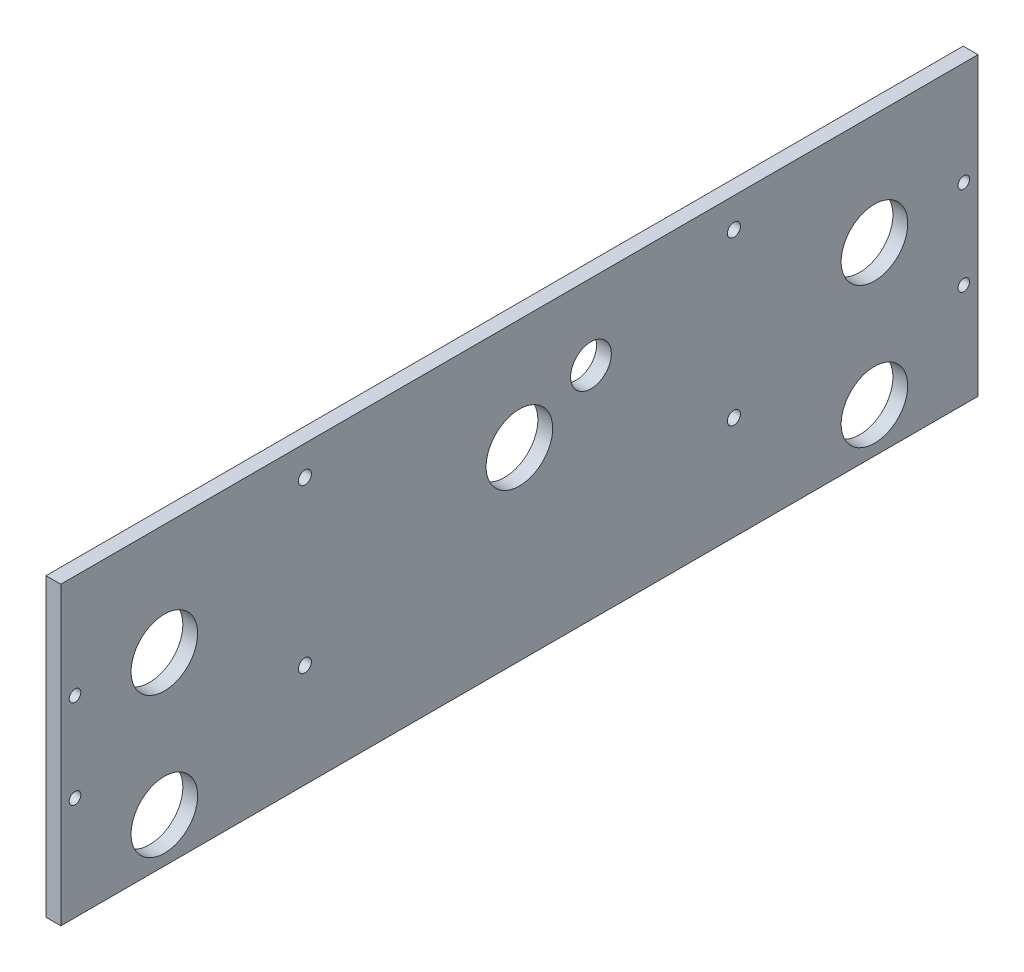
ISO-10303-21;
HEADER;
FILE_DESCRIPTION(('STEP AP214'),'2;1');
FILE_NAME('part.step','',(''),(''),'','','');
FILE_SCHEMA(('AUTOMOTIVE_DESIGN { 1 0 10303 214 1 1 1 1 }'));
ENDSEC;
DATA;
#1=APPLICATION_CONTEXT('core data for automotive mechanical design processes');
#2=APPLICATION_PROTOCOL_DEFINITION('international standard','automotive_design',2000,#1);
#3=PRODUCT_CONTEXT('',#1,'mechanical');
#4=PRODUCT('Part','Part','',(#3));
#5=PRODUCT_RELATED_PRODUCT_CATEGORY('part','',(#4));
#6=PRODUCT_DEFINITION_FORMATION('','',#4);
#7=PRODUCT_DEFINITION_CONTEXT('part definition',#1,'design');
#8=PRODUCT_DEFINITION('design','',#6,#7);
#9=PRODUCT_DEFINITION_SHAPE('','',#8);
#10=(LENGTH_UNIT() NAMED_UNIT(*) SI_UNIT(.MILLI.,.METRE.));
#11=(NAMED_UNIT(*) PLANE_ANGLE_UNIT() SI_UNIT($,.RADIAN.));
#12=(NAMED_UNIT(*) SI_UNIT($,.STERADIAN.) SOLID_ANGLE_UNIT());
#13=UNCERTAINTY_MEASURE_WITH_UNIT(LENGTH_MEASURE(1.E-05),#10,'distance_accuracy_value','');
#14=(GEOMETRIC_REPRESENTATION_CONTEXT(3) GLOBAL_UNCERTAINTY_ASSIGNED_CONTEXT((#13)) GLOBAL_UNIT_ASSIGNED_CONTEXT((#10,
#11,#12)) REPRESENTATION_CONTEXT('',''));
#15=CARTESIAN_POINT('',(0.,0.,0.));
#16=DIRECTION('',(0.,0.,1.));
#17=DIRECTION('',(1.,0.,0.));
#18=AXIS2_PLACEMENT_3D('',#15,#16,#17);
#19=CARTESIAN_POINT('',(6.35,63.5,-196.85));
#20=DIRECTION('',(0.,0.,1.));
#21=DIRECTION('',(1.,0.,0.));
#22=AXIS2_PLACEMENT_3D('',#19,#20,#21);
#23=PLANE('',#22);
#24=DIRECTION('',(0.,1.,0.));
#25=VECTOR('',#24,1.);
#26=CARTESIAN_POINT('',(0.,63.5,-196.85));
#27=LINE('',#26,#25);
#28=CARTESIAN_POINT('',(0.,-63.5,-196.85));
#29=VERTEX_POINT('',#28);
#30=CARTESIAN_POINT('',(0.,63.5,-196.85));
#31=VERTEX_POINT('',#30);
#32=EDGE_CURVE('E102',#29,#31,#27,.T.);
#33=ORIENTED_EDGE('',*,*,#32,.T.);
#34=DIRECTION('',(-1.,0.,0.));
#35=VECTOR('',#34,1.);
#36=CARTESIAN_POINT('',(6.35,63.5,-196.85));
#37=LINE('',#36,#35);
#38=CARTESIAN_POINT('',(6.35,63.5,-196.85));
#39=VERTEX_POINT('',#38);
#40=EDGE_CURVE('E11',#39,#31,#37,.T.);
#41=ORIENTED_EDGE('',*,*,#40,.F.);
#42=DIRECTION('',(0.,1.,0.));
#43=VECTOR('',#42,1.);
#44=CARTESIAN_POINT('',(6.35,63.5,-196.85));
#45=LINE('',#44,#43);
#46=CARTESIAN_POINT('',(6.35,-63.5,-196.85));
#47=VERTEX_POINT('',#46);
#48=EDGE_CURVE('E90',#47,#39,#45,.T.);
#49=ORIENTED_EDGE('',*,*,#48,.F.);
#50=DIRECTION('',(-1.,0.,0.));
#51=VECTOR('',#50,1.);
#52=CARTESIAN_POINT('',(6.35,-63.5,-196.85));
#53=LINE('',#52,#51);
#54=EDGE_CURVE('E98',#47,#29,#53,.T.);
#55=ORIENTED_EDGE('',*,*,#54,.T.);
#56=EDGE_LOOP('',(#33,#41,#49,#55));
#57=FACE_BOUND('',#56,.T.);
#58=ADVANCED_FACE('F39',(#57),#23,.F.);
#59=CARTESIAN_POINT('',(6.35,63.5,196.85));
#60=DIRECTION('',(0.,-1.,0.));
#61=DIRECTION('',(0.,0.,-1.));
#62=AXIS2_PLACEMENT_3D('',#59,#60,#61);
#63=PLANE('',#62);
#64=DIRECTION('',(0.,0.,1.));
#65=VECTOR('',#64,1.);
#66=CARTESIAN_POINT('',(0.,63.5,196.85));
#67=LINE('',#66,#65);
#68=CARTESIAN_POINT('',(0.,63.5,196.85));
#69=VERTEX_POINT('',#68);
#70=EDGE_CURVE('E94',#31,#69,#67,.T.);
#71=ORIENTED_EDGE('',*,*,#70,.T.);
#72=DIRECTION('',(-1.,0.,0.));
#73=VECTOR('',#72,1.);
#74=CARTESIAN_POINT('',(6.35,63.5,196.85));
#75=LINE('',#74,#73);
#76=CARTESIAN_POINT('',(6.35,63.5,196.85));
#77=VERTEX_POINT('',#76);
#78=EDGE_CURVE('E47',#77,#69,#75,.T.);
#79=ORIENTED_EDGE('',*,*,#78,.F.);
#80=DIRECTION('',(0.,0.,1.));
#81=VECTOR('',#80,1.);
#82=CARTESIAN_POINT('',(6.35,63.5,196.85));
#83=LINE('',#82,#81);
#84=EDGE_CURVE('E85',#39,#77,#83,.T.);
#85=ORIENTED_EDGE('',*,*,#84,.F.);
#86=ORIENTED_EDGE('',*,*,#40,.T.);
#87=EDGE_LOOP('',(#71,#79,#85,#86));
#88=FACE_BOUND('',#87,.T.);
#89=ADVANCED_FACE('F93',(#88),#63,.F.);
#90=CARTESIAN_POINT('',(6.35,63.5,196.85));
#91=DIRECTION('',(0.,0.,-1.));
#92=DIRECTION('',(-1.,0.,0.));
#93=AXIS2_PLACEMENT_3D('',#90,#91,#92);
#94=PLANE('',#93);
#95=DIRECTION('',(0.,-1.,0.));
#96=VECTOR('',#95,1.);
#97=CARTESIAN_POINT('',(0.,63.5,196.85));
#98=LINE('',#97,#96);
#99=CARTESIAN_POINT('',(0.,-63.5,196.85));
#100=VERTEX_POINT('',#99);
#101=EDGE_CURVE('E72',#69,#100,#98,.T.);
#102=ORIENTED_EDGE('',*,*,#101,.T.);
#103=DIRECTION('',(-1.,0.,0.));
#104=VECTOR('',#103,1.);
#105=CARTESIAN_POINT('',(6.35,-63.5,196.85));
#106=LINE('',#105,#104);
#107=CARTESIAN_POINT('',(6.35,-63.5,196.85));
#108=VERTEX_POINT('',#107);
#109=EDGE_CURVE('E95',#108,#100,#106,.T.);
#110=ORIENTED_EDGE('',*,*,#109,.F.);
#111=DIRECTION('',(0.,-1.,0.));
#112=VECTOR('',#111,1.);
#113=CARTESIAN_POINT('',(6.35,63.5,196.85));
#114=LINE('',#113,#112);
#115=EDGE_CURVE('E88',#77,#108,#114,.T.);
#116=ORIENTED_EDGE('',*,*,#115,.F.);
#117=ORIENTED_EDGE('',*,*,#78,.T.);
#118=EDGE_LOOP('',(#102,#110,#116,#117));
#119=FACE_BOUND('',#118,.T.);
#120=ADVANCED_FACE('F96',(#119),#94,.F.);
#121=CARTESIAN_POINT('',(6.35,-63.5,196.85));
#122=DIRECTION('',(0.,1.,0.));
#123=DIRECTION('',(0.,0.,1.));
#124=AXIS2_PLACEMENT_3D('',#121,#122,#123);
#125=PLANE('',#124);
#126=DIRECTION('',(0.,0.,-1.));
#127=VECTOR('',#126,1.);
#128=CARTESIAN_POINT('',(0.,-63.5,196.85));
#129=LINE('',#128,#127);
#130=EDGE_CURVE('E78',#100,#29,#129,.T.);
#131=ORIENTED_EDGE('',*,*,#130,.T.);
#132=ORIENTED_EDGE('',*,*,#54,.F.);
#133=DIRECTION('',(0.,0.,-1.));
#134=VECTOR('',#133,1.);
#135=CARTESIAN_POINT('',(6.35,-63.5,196.85));
#136=LINE('',#135,#134);
#137=EDGE_CURVE('E55',#108,#47,#136,.T.);
#138=ORIENTED_EDGE('',*,*,#137,.F.);
#139=ORIENTED_EDGE('',*,*,#109,.T.);
#140=EDGE_LOOP('',(#131,#132,#138,#139));
#141=FACE_BOUND('',#140,.T.);
#142=ADVANCED_FACE('F110',(#141),#125,.F.);
#143=CARTESIAN_POINT('',(6.35,0.,0.));
#144=DIRECTION('',(1.,0.,0.));
#145=DIRECTION('',(0.,0.,-1.));
#146=AXIS2_PLACEMENT_3D('',#143,#144,#145);
#147=PLANE('',#146);
#148=CARTESIAN_POINT('',(6.35,50.8,-92.075));
#149=DIRECTION('',(-1.,0.,0.));
#150=DIRECTION('',(0.,0.,1.));
#151=AXIS2_PLACEMENT_3D('',#148,#149,#150);
#152=CIRCLE('',#151,2.8067);
#153=CARTESIAN_POINT('',(6.35,50.8,-89.2683));
#154=VERTEX_POINT('',#153);
#155=EDGE_CURVE('E202',#154,#154,#152,.T.);
#156=ORIENTED_EDGE('',*,*,#155,.T.);
#157=EDGE_LOOP('',(#156));
#158=FACE_BOUND('',#157,.T.);
#159=CARTESIAN_POINT('',(6.35,-19.05,-92.075));
#160=DIRECTION('',(-1.,0.,0.));
#161=DIRECTION('',(0.,0.,1.));
#162=AXIS2_PLACEMENT_3D('',#159,#160,#161);
#163=CIRCLE('',#162,2.8067);
#164=CARTESIAN_POINT('',(6.35,-19.05,-89.2683));
#165=VERTEX_POINT('',#164);
#166=EDGE_CURVE('E193',#165,#165,#163,.T.);
#167=ORIENTED_EDGE('',*,*,#166,.T.);
#168=EDGE_LOOP('',(#167));
#169=FACE_BOUND('',#168,.T.);
#170=CARTESIAN_POINT('',(6.35,-19.05,92.075));
#171=DIRECTION('',(-1.,0.,0.));
#172=DIRECTION('',(0.,0.,1.));
#173=AXIS2_PLACEMENT_3D('',#170,#171,#172);
#174=CIRCLE('',#173,2.8067);
#175=CARTESIAN_POINT('',(6.35,-19.05,94.8817));
#176=VERTEX_POINT('',#175);
#177=EDGE_CURVE('E184',#176,#176,#174,.T.);
#178=ORIENTED_EDGE('',*,*,#177,.T.);
#179=EDGE_LOOP('',(#178));
#180=FACE_BOUND('',#179,.T.);
#181=CARTESIAN_POINT('',(6.35,50.8,92.075));
#182=DIRECTION('',(-1.,0.,0.));
#183=DIRECTION('',(0.,0.,1.));
#184=AXIS2_PLACEMENT_3D('',#181,#182,#183);
#185=CIRCLE('',#184,2.8067);
#186=CARTESIAN_POINT('',(6.35,50.8,94.8817));
#187=VERTEX_POINT('',#186);
#188=EDGE_CURVE('E175',#187,#187,#185,.T.);
#189=ORIENTED_EDGE('',*,*,#188,.T.);
#190=EDGE_LOOP('',(#189));
#191=FACE_BOUND('',#190,.T.);
#192=CARTESIAN_POINT('',(6.35,19.05,190.754));
#193=DIRECTION('',(1.,0.,0.));
#194=DIRECTION('',(0.,0.,-1.));
#195=AXIS2_PLACEMENT_3D('',#192,#193,#194);
#196=CIRCLE('',#195,2.4892);
#197=CARTESIAN_POINT('',(6.35,19.05,188.2648));
#198=VERTEX_POINT('',#197);
#199=EDGE_CURVE('E172',#198,#198,#196,.T.);
#200=ORIENTED_EDGE('',*,*,#199,.F.);
#201=EDGE_LOOP('',(#200));
#202=FACE_BOUND('',#201,.T.);
#203=CARTESIAN_POINT('',(6.35,-19.05,190.754));
#204=DIRECTION('',(1.,0.,0.));
#205=DIRECTION('',(0.,0.,-1.));
#206=AXIS2_PLACEMENT_3D('',#203,#204,#205);
#207=CIRCLE('',#206,2.4892);
#208=CARTESIAN_POINT('',(6.35,-19.05,188.2648));
#209=VERTEX_POINT('',#208);
#210=EDGE_CURVE('E166',#209,#209,#207,.T.);
#211=ORIENTED_EDGE('',*,*,#210,.F.);
#212=EDGE_LOOP('',(#211));
#213=FACE_BOUND('',#212,.T.);
#214=CARTESIAN_POINT('',(6.35,19.05,-190.754));
#215=DIRECTION('',(1.,0.,0.));
#216=DIRECTION('',(0.,0.,-1.));
#217=AXIS2_PLACEMENT_3D('',#214,#215,#216);
#218=CIRCLE('',#217,2.4892);
#219=CARTESIAN_POINT('',(6.35,19.05,-193.2432));
#220=VERTEX_POINT('',#219);
#221=EDGE_CURVE('E160',#220,#220,#218,.T.);
#222=ORIENTED_EDGE('',*,*,#221,.F.);
#223=EDGE_LOOP('',(#222));
#224=FACE_BOUND('',#223,.T.);
#225=CARTESIAN_POINT('',(6.35,-19.05,-190.754));
#226=DIRECTION('',(1.,0.,0.));
#227=DIRECTION('',(0.,0.,-1.));
#228=AXIS2_PLACEMENT_3D('',#225,#226,#227);
#229=CIRCLE('',#228,2.4892);
#230=CARTESIAN_POINT('',(6.35,-19.05,-193.2432));
#231=VERTEX_POINT('',#230);
#232=EDGE_CURVE('E154',#231,#231,#229,.T.);
#233=ORIENTED_EDGE('',*,*,#232,.F.);
#234=EDGE_LOOP('',(#233));
#235=FACE_BOUND('',#234,.T.);
#236=CARTESIAN_POINT('',(6.35,15.875,152.4));
#237=DIRECTION('',(1.,0.,0.));
#238=DIRECTION('',(0.,0.,-1.));
#239=AXIS2_PLACEMENT_3D('',#236,#237,#238);
#240=CIRCLE('',#239,14.2875);
#241=CARTESIAN_POINT('',(6.35,15.875,138.1125));
#242=VERTEX_POINT('',#241);
#243=EDGE_CURVE('E119',#242,#242,#240,.T.);
#244=ORIENTED_EDGE('',*,*,#243,.F.);
#245=EDGE_LOOP('',(#244));
#246=FACE_BOUND('',#245,.T.);
#247=CARTESIAN_POINT('',(6.35,15.875,-152.4));
#248=DIRECTION('',(1.,0.,0.));
#249=DIRECTION('',(0.,0.,-1.));
#250=AXIS2_PLACEMENT_3D('',#247,#248,#249);
#251=CIRCLE('',#250,14.2875);
#252=CARTESIAN_POINT('',(6.35,15.875,-166.6875));
#253=VERTEX_POINT('',#252);
#254=EDGE_CURVE('E138',#253,#253,#251,.T.);
#255=ORIENTED_EDGE('',*,*,#254,.F.);
#256=EDGE_LOOP('',(#255));
#257=FACE_BOUND('',#256,.T.);
#258=CARTESIAN_POINT('',(6.35,-44.45,152.4));
#259=DIRECTION('',(1.,0.,0.));
#260=DIRECTION('',(0.,0.,-1.));
#261=AXIS2_PLACEMENT_3D('',#258,#259,#260);
#262=CIRCLE('',#261,14.2875);
#263=CARTESIAN_POINT('',(6.35,-44.45,138.1125));
#264=VERTEX_POINT('',#263);
#265=EDGE_CURVE('E132',#264,#264,#262,.T.);
#266=ORIENTED_EDGE('',*,*,#265,.F.);
#267=EDGE_LOOP('',(#266));
#268=FACE_BOUND('',#267,.T.);
#269=CARTESIAN_POINT('',(6.35,-44.45,-152.4));
#270=DIRECTION('',(1.,0.,0.));
#271=DIRECTION('',(0.,0.,-1.));
#272=AXIS2_PLACEMENT_3D('',#269,#270,#271);
#273=CIRCLE('',#272,14.2875);
#274=CARTESIAN_POINT('',(6.35,-44.45,-166.6875));
#275=VERTEX_POINT('',#274);
#276=EDGE_CURVE('E125',#275,#275,#273,.T.);
#277=ORIENTED_EDGE('',*,*,#276,.F.);
#278=EDGE_LOOP('',(#277));
#279=FACE_BOUND('',#278,.T.);
#280=CARTESIAN_POINT('',(6.35,31.115,-30.7172020210175));
#281=DIRECTION('',(1.,0.,0.));
#282=DIRECTION('',(0.,0.,-1.));
#283=AXIS2_PLACEMENT_3D('',#280,#281,#282);
#284=CIRCLE('',#283,8.750046);
#285=CARTESIAN_POINT('',(6.35,31.115,-39.4672480210175));
#286=VERTEX_POINT('',#285);
#287=EDGE_CURVE('E126',#286,#286,#284,.T.);
#288=ORIENTED_EDGE('',*,*,#287,.F.);
#289=EDGE_LOOP('',(#288));
#290=FACE_BOUND('',#289,.T.);
#291=CARTESIAN_POINT('',(6.35,15.875,0.));
#292=DIRECTION('',(1.,0.,0.));
#293=DIRECTION('',(0.,0.,-1.));
#294=AXIS2_PLACEMENT_3D('',#291,#292,#293);
#295=CIRCLE('',#294,14.2875);
#296=CARTESIAN_POINT('',(6.35,15.875,-14.2875));
#297=VERTEX_POINT('',#296);
#298=EDGE_CURVE('E116',#297,#297,#295,.T.);
#299=ORIENTED_EDGE('',*,*,#298,.F.);
#300=EDGE_LOOP('',(#299));
#301=FACE_BOUND('',#300,.T.);
#302=ORIENTED_EDGE('',*,*,#48,.T.);
#303=ORIENTED_EDGE('',*,*,#84,.T.);
#304=ORIENTED_EDGE('',*,*,#115,.T.);
#305=ORIENTED_EDGE('',*,*,#137,.T.);
#306=EDGE_LOOP('',(#302,#303,#304,#305));
#307=FACE_BOUND('',#306,.T.);
#308=ADVANCED_FACE('F86',(#158,#169,#180,#191,#202,#213,#224,#235,#246,#257,#268,#279,#290,#301,
#307),#147,.T.);
#309=CARTESIAN_POINT('',(0.,0.,0.));
#310=DIRECTION('',(1.,0.,0.));
#311=DIRECTION('',(0.,0.,-1.));
#312=AXIS2_PLACEMENT_3D('',#309,#310,#311);
#313=PLANE('',#312);
#314=CARTESIAN_POINT('',(0.,50.8,-92.075));
#315=DIRECTION('',(-1.,0.,0.));
#316=DIRECTION('',(0.,0.,1.));
#317=AXIS2_PLACEMENT_3D('',#314,#315,#316);
#318=CIRCLE('',#317,4.8895);
#319=CARTESIAN_POINT('',(0.,50.8,-87.1855));
#320=VERTEX_POINT('',#319);
#321=EDGE_CURVE('E208',#320,#320,#318,.T.);
#322=ORIENTED_EDGE('',*,*,#321,.F.);
#323=EDGE_LOOP('',(#322));
#324=FACE_BOUND('',#323,.T.);
#325=CARTESIAN_POINT('',(0.,-19.05,-92.075));
#326=DIRECTION('',(-1.,0.,0.));
#327=DIRECTION('',(0.,0.,1.));
#328=AXIS2_PLACEMENT_3D('',#325,#326,#327);
#329=CIRCLE('',#328,4.8895);
#330=CARTESIAN_POINT('',(0.,-19.05,-87.1855));
#331=VERTEX_POINT('',#330);
#332=EDGE_CURVE('E199',#331,#331,#329,.T.);
#333=ORIENTED_EDGE('',*,*,#332,.F.);
#334=EDGE_LOOP('',(#333));
#335=FACE_BOUND('',#334,.T.);
#336=CARTESIAN_POINT('',(0.,-19.05,92.075));
#337=DIRECTION('',(-1.,0.,0.));
#338=DIRECTION('',(0.,0.,1.));
#339=AXIS2_PLACEMENT_3D('',#336,#337,#338);
#340=CIRCLE('',#339,4.8895);
#341=CARTESIAN_POINT('',(0.,-19.05,96.9645));
#342=VERTEX_POINT('',#341);
#343=EDGE_CURVE('E190',#342,#342,#340,.T.);
#344=ORIENTED_EDGE('',*,*,#343,.F.);
#345=EDGE_LOOP('',(#344));
#346=FACE_BOUND('',#345,.T.);
#347=CARTESIAN_POINT('',(0.,50.8,92.075));
#348=DIRECTION('',(-1.,0.,0.));
#349=DIRECTION('',(0.,0.,1.));
#350=AXIS2_PLACEMENT_3D('',#347,#348,#349);
#351=CIRCLE('',#350,4.8895);
#352=CARTESIAN_POINT('',(0.,50.8,96.9645));
#353=VERTEX_POINT('',#352);
#354=EDGE_CURVE('E181',#353,#353,#351,.T.);
#355=ORIENTED_EDGE('',*,*,#354,.F.);
#356=EDGE_LOOP('',(#355));
#357=FACE_BOUND('',#356,.T.);
#358=CARTESIAN_POINT('',(0.,19.05,190.754));
#359=DIRECTION('',(1.,0.,0.));
#360=DIRECTION('',(0.,0.,-1.));
#361=AXIS2_PLACEMENT_3D('',#358,#359,#360);
#362=CIRCLE('',#361,2.4892);
#363=CARTESIAN_POINT('',(0.,19.05,188.2648));
#364=VERTEX_POINT('',#363);
#365=EDGE_CURVE('E169',#364,#364,#362,.T.);
#366=ORIENTED_EDGE('',*,*,#365,.T.);
#367=EDGE_LOOP('',(#366));
#368=FACE_BOUND('',#367,.T.);
#369=CARTESIAN_POINT('',(0.,-19.05,190.754));
#370=DIRECTION('',(1.,0.,0.));
#371=DIRECTION('',(0.,0.,-1.));
#372=AXIS2_PLACEMENT_3D('',#369,#370,#371);
#373=CIRCLE('',#372,2.4892);
#374=CARTESIAN_POINT('',(0.,-19.05,188.2648));
#375=VERTEX_POINT('',#374);
#376=EDGE_CURVE('E163',#375,#375,#373,.T.);
#377=ORIENTED_EDGE('',*,*,#376,.T.);
#378=EDGE_LOOP('',(#377));
#379=FACE_BOUND('',#378,.T.);
#380=CARTESIAN_POINT('',(0.,19.05,-190.754));
#381=DIRECTION('',(1.,0.,0.));
#382=DIRECTION('',(0.,0.,-1.));
#383=AXIS2_PLACEMENT_3D('',#380,#381,#382);
#384=CIRCLE('',#383,2.4892);
#385=CARTESIAN_POINT('',(0.,19.05,-193.2432));
#386=VERTEX_POINT('',#385);
#387=EDGE_CURVE('E157',#386,#386,#384,.T.);
#388=ORIENTED_EDGE('',*,*,#387,.T.);
#389=EDGE_LOOP('',(#388));
#390=FACE_BOUND('',#389,.T.);
#391=CARTESIAN_POINT('',(0.,-19.05,-190.754));
#392=DIRECTION('',(1.,0.,0.));
#393=DIRECTION('',(0.,0.,-1.));
#394=AXIS2_PLACEMENT_3D('',#391,#392,#393);
#395=CIRCLE('',#394,2.4892);
#396=CARTESIAN_POINT('',(0.,-19.05,-193.2432));
#397=VERTEX_POINT('',#396);
#398=EDGE_CURVE('E149',#397,#397,#395,.T.);
#399=ORIENTED_EDGE('',*,*,#398,.T.);
#400=EDGE_LOOP('',(#399));
#401=FACE_BOUND('',#400,.T.);
#402=CARTESIAN_POINT('',(0.,15.875,152.4));
#403=DIRECTION('',(1.,0.,0.));
#404=DIRECTION('',(0.,0.,-1.));
#405=AXIS2_PLACEMENT_3D('',#402,#403,#404);
#406=CIRCLE('',#405,14.2875);
#407=CARTESIAN_POINT('',(0.,15.875,138.1125));
#408=VERTEX_POINT('',#407);
#409=EDGE_CURVE('E141',#408,#408,#406,.T.);
#410=ORIENTED_EDGE('',*,*,#409,.T.);
#411=EDGE_LOOP('',(#410));
#412=FACE_BOUND('',#411,.T.);
#413=CARTESIAN_POINT('',(0.,15.875,-152.4));
#414=DIRECTION('',(1.,0.,0.));
#415=DIRECTION('',(0.,0.,-1.));
#416=AXIS2_PLACEMENT_3D('',#413,#414,#415);
#417=CIRCLE('',#416,14.2875);
#418=CARTESIAN_POINT('',(0.,15.875,-166.6875));
#419=VERTEX_POINT('',#418);
#420=EDGE_CURVE('E135',#419,#419,#417,.T.);
#421=ORIENTED_EDGE('',*,*,#420,.T.);
#422=EDGE_LOOP('',(#421));
#423=FACE_BOUND('',#422,.T.);
#424=CARTESIAN_POINT('',(0.,-44.45,152.4));
#425=DIRECTION('',(1.,0.,0.));
#426=DIRECTION('',(0.,0.,-1.));
#427=AXIS2_PLACEMENT_3D('',#424,#425,#426);
#428=CIRCLE('',#427,14.2875);
#429=CARTESIAN_POINT('',(0.,-44.45,138.1125));
#430=VERTEX_POINT('',#429);
#431=EDGE_CURVE('E129',#430,#430,#428,.T.);
#432=ORIENTED_EDGE('',*,*,#431,.T.);
#433=EDGE_LOOP('',(#432));
#434=FACE_BOUND('',#433,.T.);
#435=CARTESIAN_POINT('',(0.,-44.45,-152.4));
#436=DIRECTION('',(1.,0.,0.));
#437=DIRECTION('',(0.,0.,-1.));
#438=AXIS2_PLACEMENT_3D('',#435,#436,#437);
#439=CIRCLE('',#438,14.2875);
#440=CARTESIAN_POINT('',(0.,-44.45,-166.6875));
#441=VERTEX_POINT('',#440);
#442=EDGE_CURVE('E122',#441,#441,#439,.T.);
#443=ORIENTED_EDGE('',*,*,#442,.T.);
#444=EDGE_LOOP('',(#443));
#445=FACE_BOUND('',#444,.T.);
#446=CARTESIAN_POINT('',(0.,31.115,-30.7172020210175));
#447=DIRECTION('',(1.,0.,0.));
#448=DIRECTION('',(0.,0.,-1.));
#449=AXIS2_PLACEMENT_3D('',#446,#447,#448);
#450=CIRCLE('',#449,8.750046);
#451=CARTESIAN_POINT('',(0.,31.115,-39.4672480210175));
#452=VERTEX_POINT('',#451);
#453=EDGE_CURVE('E146',#452,#452,#450,.T.);
#454=ORIENTED_EDGE('',*,*,#453,.T.);
#455=EDGE_LOOP('',(#454));
#456=FACE_BOUND('',#455,.T.);
#457=CARTESIAN_POINT('',(0.,15.875,0.));
#458=DIRECTION('',(1.,0.,0.));
#459=DIRECTION('',(0.,0.,-1.));
#460=AXIS2_PLACEMENT_3D('',#457,#458,#459);
#461=CIRCLE('',#460,14.2875);
#462=CARTESIAN_POINT('',(0.,15.875,-14.2875));
#463=VERTEX_POINT('',#462);
#464=EDGE_CURVE('E105',#463,#463,#461,.T.);
#465=ORIENTED_EDGE('',*,*,#464,.T.);
#466=EDGE_LOOP('',(#465));
#467=FACE_BOUND('',#466,.T.);
#468=ORIENTED_EDGE('',*,*,#32,.F.);
#469=ORIENTED_EDGE('',*,*,#130,.F.);
#470=ORIENTED_EDGE('',*,*,#101,.F.);
#471=ORIENTED_EDGE('',*,*,#70,.F.);
#472=EDGE_LOOP('',(#468,#469,#470,#471));
#473=FACE_BOUND('',#472,.T.);
#474=ADVANCED_FACE('F113',(#324,#335,#346,#357,#368,#379,#390,#401,#412,#423,#434,#445,#456,
#467,#473),#313,.F.);
#475=CARTESIAN_POINT('',(0.,15.875,0.));
#476=DIRECTION('',(1.,0.,0.));
#477=DIRECTION('',(0.,0.,-1.));
#478=AXIS2_PLACEMENT_3D('',#475,#476,#477);
#479=CYLINDRICAL_SURFACE('',#478,14.2875);
#480=ORIENTED_EDGE('',*,*,#464,.F.);
#481=EDGE_LOOP('',(#480));
#482=FACE_BOUND('',#481,.T.);
#483=ORIENTED_EDGE('',*,*,#298,.T.);
#484=EDGE_LOOP('',(#483));
#485=FACE_BOUND('',#484,.T.);
#486=ADVANCED_FACE('F216',(#482,#485),#479,.F.);
#487=CARTESIAN_POINT('',(0.,31.115,-30.7172020210175));
#488=DIRECTION('',(1.,0.,0.));
#489=DIRECTION('',(0.,0.,-1.));
#490=AXIS2_PLACEMENT_3D('',#487,#488,#489);
#491=CYLINDRICAL_SURFACE('',#490,8.750046);
#492=ORIENTED_EDGE('',*,*,#453,.F.);
#493=EDGE_LOOP('',(#492));
#494=FACE_BOUND('',#493,.T.);
#495=ORIENTED_EDGE('',*,*,#287,.T.);
#496=EDGE_LOOP('',(#495));
#497=FACE_BOUND('',#496,.T.);
#498=ADVANCED_FACE('F246',(#494,#497),#491,.F.);
#499=CARTESIAN_POINT('',(0.,-44.45,-152.4));
#500=DIRECTION('',(1.,0.,0.));
#501=DIRECTION('',(0.,0.,-1.));
#502=AXIS2_PLACEMENT_3D('',#499,#500,#501);
#503=CYLINDRICAL_SURFACE('',#502,14.2875);
#504=ORIENTED_EDGE('',*,*,#442,.F.);
#505=EDGE_LOOP('',(#504));
#506=FACE_BOUND('',#505,.T.);
#507=ORIENTED_EDGE('',*,*,#276,.T.);
#508=EDGE_LOOP('',(#507));
#509=FACE_BOUND('',#508,.T.);
#510=ADVANCED_FACE('F291',(#506,#509),#503,.F.);
#511=CARTESIAN_POINT('',(0.,-44.45,152.4));
#512=DIRECTION('',(1.,0.,0.));
#513=DIRECTION('',(0.,0.,-1.));
#514=AXIS2_PLACEMENT_3D('',#511,#512,#513);
#515=CYLINDRICAL_SURFACE('',#514,14.2875);
#516=ORIENTED_EDGE('',*,*,#431,.F.);
#517=EDGE_LOOP('',(#516));
#518=FACE_BOUND('',#517,.T.);
#519=ORIENTED_EDGE('',*,*,#265,.T.);
#520=EDGE_LOOP('',(#519));
#521=FACE_BOUND('',#520,.T.);
#522=ADVANCED_FACE('F302',(#518,#521),#515,.F.);
#523=CARTESIAN_POINT('',(0.,15.875,-152.4));
#524=DIRECTION('',(1.,0.,0.));
#525=DIRECTION('',(0.,0.,-1.));
#526=AXIS2_PLACEMENT_3D('',#523,#524,#525);
#527=CYLINDRICAL_SURFACE('',#526,14.2875);
#528=ORIENTED_EDGE('',*,*,#420,.F.);
#529=EDGE_LOOP('',(#528));
#530=FACE_BOUND('',#529,.T.);
#531=ORIENTED_EDGE('',*,*,#254,.T.);
#532=EDGE_LOOP('',(#531));
#533=FACE_BOUND('',#532,.T.);
#534=ADVANCED_FACE('F313',(#530,#533),#527,.F.);
#535=CARTESIAN_POINT('',(0.,15.875,152.4));
#536=DIRECTION('',(1.,0.,0.));
#537=DIRECTION('',(0.,0.,-1.));
#538=AXIS2_PLACEMENT_3D('',#535,#536,#537);
#539=CYLINDRICAL_SURFACE('',#538,14.2875);
#540=ORIENTED_EDGE('',*,*,#409,.F.);
#541=EDGE_LOOP('',(#540));
#542=FACE_BOUND('',#541,.T.);
#543=ORIENTED_EDGE('',*,*,#243,.T.);
#544=EDGE_LOOP('',(#543));
#545=FACE_BOUND('',#544,.T.);
#546=ADVANCED_FACE('F324',(#542,#545),#539,.F.);
#547=CARTESIAN_POINT('',(6.35,-19.05,-190.754));
#548=DIRECTION('',(1.,0.,0.));
#549=DIRECTION('',(0.,0.,-1.));
#550=AXIS2_PLACEMENT_3D('',#547,#548,#549);
#551=CYLINDRICAL_SURFACE('',#550,2.4892);
#552=ORIENTED_EDGE('',*,*,#398,.F.);
#553=EDGE_LOOP('',(#552));
#554=FACE_BOUND('',#553,.T.);
#555=ORIENTED_EDGE('',*,*,#232,.T.);
#556=EDGE_LOOP('',(#555));
#557=FACE_BOUND('',#556,.T.);
#558=ADVANCED_FACE('F335',(#554,#557),#551,.F.);
#559=CARTESIAN_POINT('',(6.35,19.05,-190.754));
#560=DIRECTION('',(1.,0.,0.));
#561=DIRECTION('',(0.,0.,-1.));
#562=AXIS2_PLACEMENT_3D('',#559,#560,#561);
#563=CYLINDRICAL_SURFACE('',#562,2.4892);
#564=ORIENTED_EDGE('',*,*,#387,.F.);
#565=EDGE_LOOP('',(#564));
#566=FACE_BOUND('',#565,.T.);
#567=ORIENTED_EDGE('',*,*,#221,.T.);
#568=EDGE_LOOP('',(#567));
#569=FACE_BOUND('',#568,.T.);
#570=ADVANCED_FACE('F346',(#566,#569),#563,.F.);
#571=CARTESIAN_POINT('',(6.35,-19.05,190.754));
#572=DIRECTION('',(1.,0.,0.));
#573=DIRECTION('',(0.,0.,-1.));
#574=AXIS2_PLACEMENT_3D('',#571,#572,#573);
#575=CYLINDRICAL_SURFACE('',#574,2.4892);
#576=ORIENTED_EDGE('',*,*,#376,.F.);
#577=EDGE_LOOP('',(#576));
#578=FACE_BOUND('',#577,.T.);
#579=ORIENTED_EDGE('',*,*,#210,.T.);
#580=EDGE_LOOP('',(#579));
#581=FACE_BOUND('',#580,.T.);
#582=ADVANCED_FACE('F357',(#578,#581),#575,.F.);
#583=CARTESIAN_POINT('',(6.35,19.05,190.754));
#584=DIRECTION('',(1.,0.,0.));
#585=DIRECTION('',(0.,0.,-1.));
#586=AXIS2_PLACEMENT_3D('',#583,#584,#585);
#587=CYLINDRICAL_SURFACE('',#586,2.4892);
#588=ORIENTED_EDGE('',*,*,#365,.F.);
#589=EDGE_LOOP('',(#588));
#590=FACE_BOUND('',#589,.T.);
#591=ORIENTED_EDGE('',*,*,#199,.T.);
#592=EDGE_LOOP('',(#591));
#593=FACE_BOUND('',#592,.T.);
#594=ADVANCED_FACE('F368',(#590,#593),#587,.F.);
#595=CARTESIAN_POINT('',(0.,50.8,92.075));
#596=DIRECTION('',(-1.,0.,0.));
#597=DIRECTION('',(0.,0.,1.));
#598=AXIS2_PLACEMENT_3D('',#595,#596,#597);
#599=CYLINDRICAL_SURFACE('',#598,2.8067);
#600=ORIENTED_EDGE('',*,*,#188,.F.);
#601=EDGE_LOOP('',(#600));
#602=FACE_BOUND('',#601,.T.);
#603=CARTESIAN_POINT('',(2.39598731855992,50.8,92.075));
#604=DIRECTION('',(-1.,0.,0.));
#605=DIRECTION('',(0.,0.,1.));
#606=AXIS2_PLACEMENT_3D('',#603,#604,#605);
#607=CIRCLE('',#606,2.8067);
#608=CARTESIAN_POINT('',(2.39598731855992,50.8,94.8817));
#609=VERTEX_POINT('',#608);
#610=EDGE_CURVE('E178',#609,#609,#607,.T.);
#611=ORIENTED_EDGE('',*,*,#610,.T.);
#612=EDGE_LOOP('',(#611));
#613=FACE_BOUND('',#612,.T.);
#614=ADVANCED_FACE('F378',(#602,#613),#599,.F.);
#615=CARTESIAN_POINT('',(0.,50.8,92.075));
#616=DIRECTION('',(-1.,0.,0.));
#617=DIRECTION('',(0.,0.,1.));
#618=AXIS2_PLACEMENT_3D('',#615,#616,#617);
#619=CONICAL_SURFACE('',#618,4.8895,0.715584993317674);
#620=ORIENTED_EDGE('',*,*,#610,.F.);
#621=EDGE_LOOP('',(#620));
#622=FACE_BOUND('',#621,.T.);
#623=ORIENTED_EDGE('',*,*,#354,.T.);
#624=EDGE_LOOP('',(#623));
#625=FACE_BOUND('',#624,.T.);
#626=ADVANCED_FACE('F400',(#622,#625),#619,.F.);
#627=CARTESIAN_POINT('',(0.,-19.05,92.075));
#628=DIRECTION('',(-1.,0.,0.));
#629=DIRECTION('',(0.,0.,1.));
#630=AXIS2_PLACEMENT_3D('',#627,#628,#629);
#631=CYLINDRICAL_SURFACE('',#630,2.8067);
#632=ORIENTED_EDGE('',*,*,#177,.F.);
#633=EDGE_LOOP('',(#632));
#634=FACE_BOUND('',#633,.T.);
#635=CARTESIAN_POINT('',(2.39598731855992,-19.05,92.075));
#636=DIRECTION('',(-1.,0.,0.));
#637=DIRECTION('',(0.,0.,1.));
#638=AXIS2_PLACEMENT_3D('',#635,#636,#637);
#639=CIRCLE('',#638,2.8067);
#640=CARTESIAN_POINT('',(2.39598731855992,-19.05,94.8817));
#641=VERTEX_POINT('',#640);
#642=EDGE_CURVE('E187',#641,#641,#639,.T.);
#643=ORIENTED_EDGE('',*,*,#642,.T.);
#644=EDGE_LOOP('',(#643));
#645=FACE_BOUND('',#644,.T.);
#646=ADVANCED_FACE('F411',(#634,#645),#631,.F.);
#647=CARTESIAN_POINT('',(0.,-19.05,92.075));
#648=DIRECTION('',(-1.,0.,0.));
#649=DIRECTION('',(0.,0.,1.));
#650=AXIS2_PLACEMENT_3D('',#647,#648,#649);
#651=CONICAL_SURFACE('',#650,4.8895,0.715584993317675);
#652=ORIENTED_EDGE('',*,*,#642,.F.);
#653=EDGE_LOOP('',(#652));
#654=FACE_BOUND('',#653,.T.);
#655=ORIENTED_EDGE('',*,*,#343,.T.);
#656=EDGE_LOOP('',(#655));
#657=FACE_BOUND('',#656,.T.);
#658=ADVANCED_FACE('F422',(#654,#657),#651,.F.);
#659=CARTESIAN_POINT('',(0.,-19.05,-92.075));
#660=DIRECTION('',(-1.,0.,0.));
#661=DIRECTION('',(0.,0.,1.));
#662=AXIS2_PLACEMENT_3D('',#659,#660,#661);
#663=CYLINDRICAL_SURFACE('',#662,2.8067);
#664=ORIENTED_EDGE('',*,*,#166,.F.);
#665=EDGE_LOOP('',(#664));
#666=FACE_BOUND('',#665,.T.);
#667=CARTESIAN_POINT('',(2.39598731855992,-19.05,-92.075));
#668=DIRECTION('',(-1.,0.,0.));
#669=DIRECTION('',(0.,0.,1.));
#670=AXIS2_PLACEMENT_3D('',#667,#668,#669);
#671=CIRCLE('',#670,2.8067);
#672=CARTESIAN_POINT('',(2.39598731855992,-19.05,-89.2683));
#673=VERTEX_POINT('',#672);
#674=EDGE_CURVE('E196',#673,#673,#671,.T.);
#675=ORIENTED_EDGE('',*,*,#674,.T.);
#676=EDGE_LOOP('',(#675));
#677=FACE_BOUND('',#676,.T.);
#678=ADVANCED_FACE('F433',(#666,#677),#663,.F.);
#679=CARTESIAN_POINT('',(0.,-19.05,-92.075));
#680=DIRECTION('',(-1.,0.,0.));
#681=DIRECTION('',(0.,0.,1.));
#682=AXIS2_PLACEMENT_3D('',#679,#680,#681);
#683=CONICAL_SURFACE('',#682,4.8895,0.715584993317675);
#684=ORIENTED_EDGE('',*,*,#674,.F.);
#685=EDGE_LOOP('',(#684));
#686=FACE_BOUND('',#685,.T.);
#687=ORIENTED_EDGE('',*,*,#332,.T.);
#688=EDGE_LOOP('',(#687));
#689=FACE_BOUND('',#688,.T.);
#690=ADVANCED_FACE('F444',(#686,#689),#683,.F.);
#691=CARTESIAN_POINT('',(0.,50.8,-92.075));
#692=DIRECTION('',(-1.,0.,0.));
#693=DIRECTION('',(0.,0.,1.));
#694=AXIS2_PLACEMENT_3D('',#691,#692,#693);
#695=CYLINDRICAL_SURFACE('',#694,2.8067);
#696=ORIENTED_EDGE('',*,*,#155,.F.);
#697=EDGE_LOOP('',(#696));
#698=FACE_BOUND('',#697,.T.);
#699=CARTESIAN_POINT('',(2.39598731855992,50.8,-92.075));
#700=DIRECTION('',(-1.,0.,0.));
#701=DIRECTION('',(0.,0.,1.));
#702=AXIS2_PLACEMENT_3D('',#699,#700,#701);
#703=CIRCLE('',#702,2.8067);
#704=CARTESIAN_POINT('',(2.39598731855992,50.8,-89.2683));
#705=VERTEX_POINT('',#704);
#706=EDGE_CURVE('E205',#705,#705,#703,.T.);
#707=ORIENTED_EDGE('',*,*,#706,.T.);
#708=EDGE_LOOP('',(#707));
#709=FACE_BOUND('',#708,.T.);
#710=ADVANCED_FACE('F455',(#698,#709),#695,.F.);
#711=CARTESIAN_POINT('',(0.,50.8,-92.075));
#712=DIRECTION('',(-1.,0.,0.));
#713=DIRECTION('',(0.,0.,1.));
#714=AXIS2_PLACEMENT_3D('',#711,#712,#713);
#715=CONICAL_SURFACE('',#714,4.8895,0.715584993317674);
#716=ORIENTED_EDGE('',*,*,#706,.F.);
#717=EDGE_LOOP('',(#716));
#718=FACE_BOUND('',#717,.T.);
#719=ORIENTED_EDGE('',*,*,#321,.T.);
#720=EDGE_LOOP('',(#719));
#721=FACE_BOUND('',#720,.T.);
#722=ADVANCED_FACE('F212',(#718,#721),#715,.F.);
#723=CLOSED_SHELL('',(#58,#89,#120,#142,#308,#474,#486,#498,#510,#522,#534,#546,#558,#570,#582,
#594,#614,#626,#646,#658,#678,#690,#710,#722));
#724=MANIFOLD_SOLID_BREP('B2',#723);
#725=ADVANCED_BREP_SHAPE_REPRESENTATION('',(#18,#724),#14);
#726=SHAPE_DEFINITION_REPRESENTATION(#9,#725);
ENDSEC;
END-ISO-10303-21;
